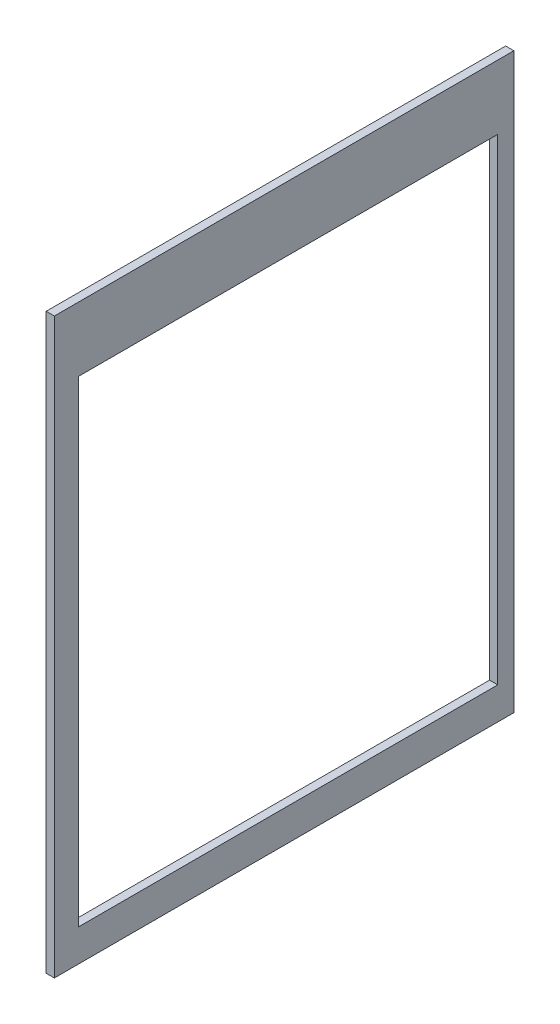
ISO-10303-21;
HEADER;
FILE_DESCRIPTION(('STEP AP214'),'2;1');
FILE_NAME('part.step','',(''),(''),'','','');
FILE_SCHEMA(('AUTOMOTIVE_DESIGN { 1 0 10303 214 1 1 1 1 }'));
ENDSEC;
DATA;
#1=APPLICATION_CONTEXT('core data for automotive mechanical design processes');
#2=APPLICATION_PROTOCOL_DEFINITION('international standard','automotive_design',2000,#1);
#3=PRODUCT_CONTEXT('',#1,'mechanical');
#4=PRODUCT('Part','Part','',(#3));
#5=PRODUCT_RELATED_PRODUCT_CATEGORY('part','',(#4));
#6=PRODUCT_DEFINITION_FORMATION('','',#4);
#7=PRODUCT_DEFINITION_CONTEXT('part definition',#1,'design');
#8=PRODUCT_DEFINITION('design','',#6,#7);
#9=PRODUCT_DEFINITION_SHAPE('','',#8);
#10=(LENGTH_UNIT() NAMED_UNIT(*) SI_UNIT(.MILLI.,.METRE.));
#11=(NAMED_UNIT(*) PLANE_ANGLE_UNIT() SI_UNIT($,.RADIAN.));
#12=(NAMED_UNIT(*) SI_UNIT($,.STERADIAN.) SOLID_ANGLE_UNIT());
#13=UNCERTAINTY_MEASURE_WITH_UNIT(LENGTH_MEASURE(1.E-05),#10,'distance_accuracy_value','');
#14=(GEOMETRIC_REPRESENTATION_CONTEXT(3) GLOBAL_UNCERTAINTY_ASSIGNED_CONTEXT((#13)) GLOBAL_UNIT_ASSIGNED_CONTEXT((#10,
#11,#12)) REPRESENTATION_CONTEXT('',''));
#15=CARTESIAN_POINT('',(0.,0.,0.));
#16=DIRECTION('',(0.,0.,1.));
#17=DIRECTION('',(1.,0.,0.));
#18=AXIS2_PLACEMENT_3D('',#15,#16,#17);
#19=CARTESIAN_POINT('',(5.,0.,0.));
#20=DIRECTION('',(1.,0.,0.));
#21=DIRECTION('',(0.,0.,-1.));
#22=AXIS2_PLACEMENT_3D('',#19,#20,#21);
#23=PLANE('',#22);
#24=DIRECTION('',(0.,-1.,0.));
#25=VECTOR('',#24,1.);
#26=CARTESIAN_POINT('',(5.,326.782544852726,389.321741886419));
#27=LINE('',#26,#25);
#28=CARTESIAN_POINT('',(5.,326.782544852726,389.321741886419));
#29=VERTEX_POINT('',#28);
#30=CARTESIAN_POINT('',(5.,-23.217455147274,389.321741886419));
#31=VERTEX_POINT('',#30);
#32=EDGE_CURVE('E136',#29,#31,#27,.T.);
#33=ORIENTED_EDGE('',*,*,#32,.T.);
#34=DIRECTION('',(0.,0.,-1.));
#35=VECTOR('',#34,1.);
#36=CARTESIAN_POINT('',(5.,-23.217455147274,389.321741886419));
#37=LINE('',#36,#35);
#38=CARTESIAN_POINT('',(5.,-23.217455147274,108.821741886419));
#39=VERTEX_POINT('',#38);
#40=EDGE_CURVE('E139',#31,#39,#37,.T.);
#41=ORIENTED_EDGE('',*,*,#40,.T.);
#42=DIRECTION('',(0.,1.,0.));
#43=VECTOR('',#42,1.);
#44=CARTESIAN_POINT('',(5.,326.782544852726,108.821741886419));
#45=LINE('',#44,#43);
#46=CARTESIAN_POINT('',(5.,326.782544852726,108.821741886419));
#47=VERTEX_POINT('',#46);
#48=EDGE_CURVE('E142',#39,#47,#45,.T.);
#49=ORIENTED_EDGE('',*,*,#48,.T.);
#50=DIRECTION('',(0.,0.,1.));
#51=VECTOR('',#50,1.);
#52=CARTESIAN_POINT('',(5.,326.782544852726,389.321741886419));
#53=LINE('',#52,#51);
#54=EDGE_CURVE('E144',#47,#29,#53,.T.);
#55=ORIENTED_EDGE('',*,*,#54,.T.);
#56=EDGE_LOOP('',(#33,#41,#49,#55));
#57=FACE_BOUND('',#56,.T.);
#58=DIRECTION('',(0.,0.,1.));
#59=VECTOR('',#58,1.);
#60=CARTESIAN_POINT('',(5.,287.483070246771,118.646610537907));
#61=LINE('',#60,#59);
#62=CARTESIAN_POINT('',(5.,287.483070246771,118.646610537907));
#63=VERTEX_POINT('',#62);
#64=CARTESIAN_POINT('',(5.,287.483070246771,374.584438909186));
#65=VERTEX_POINT('',#64);
#66=EDGE_CURVE('E108',#63,#65,#61,.T.);
#67=ORIENTED_EDGE('',*,*,#66,.F.);
#68=DIRECTION('',(0.,1.,0.));
#69=VECTOR('',#68,1.);
#70=CARTESIAN_POINT('',(5.,-3.56771784429681,118.646610537907));
#71=LINE('',#70,#69);
#72=CARTESIAN_POINT('',(5.,-3.56771784429681,118.646610537907));
#73=VERTEX_POINT('',#72);
#74=EDGE_CURVE('E100',#73,#63,#71,.T.);
#75=ORIENTED_EDGE('',*,*,#74,.F.);
#76=DIRECTION('',(0.,0.,-1.));
#77=VECTOR('',#76,1.);
#78=CARTESIAN_POINT('',(5.,-3.56771784429681,118.646610537907));
#79=LINE('',#78,#77);
#80=CARTESIAN_POINT('',(5.,-3.56771784429681,374.584438909186));
#81=VERTEX_POINT('',#80);
#82=EDGE_CURVE('E122',#81,#73,#79,.T.);
#83=ORIENTED_EDGE('',*,*,#82,.F.);
#84=DIRECTION('',(0.,-1.,0.));
#85=VECTOR('',#84,1.);
#86=CARTESIAN_POINT('',(5.,-3.56771784429681,374.584438909186));
#87=LINE('',#86,#85);
#88=EDGE_CURVE('E120',#65,#81,#87,.T.);
#89=ORIENTED_EDGE('',*,*,#88,.F.);
#90=EDGE_LOOP('',(#67,#75,#83,#89));
#91=FACE_BOUND('',#90,.T.);
#92=ADVANCED_FACE('F35',(#57,#91),#23,.T.);
#93=CARTESIAN_POINT('',(0.,0.,0.));
#94=DIRECTION('',(1.,0.,0.));
#95=DIRECTION('',(0.,0.,-1.));
#96=AXIS2_PLACEMENT_3D('',#93,#94,#95);
#97=PLANE('',#96);
#98=DIRECTION('',(0.,-1.,0.));
#99=VECTOR('',#98,1.);
#100=CARTESIAN_POINT('',(0.,326.782544852726,389.321741886419));
#101=LINE('',#100,#99);
#102=CARTESIAN_POINT('',(0.,326.782544852726,389.321741886419));
#103=VERTEX_POINT('',#102);
#104=CARTESIAN_POINT('',(0.,-23.217455147274,389.321741886419));
#105=VERTEX_POINT('',#104);
#106=EDGE_CURVE('E116',#103,#105,#101,.T.);
#107=ORIENTED_EDGE('',*,*,#106,.F.);
#108=DIRECTION('',(0.,0.,1.));
#109=VECTOR('',#108,1.);
#110=CARTESIAN_POINT('',(0.,326.782544852726,389.321741886419));
#111=LINE('',#110,#109);
#112=CARTESIAN_POINT('',(0.,326.782544852726,108.821741886419));
#113=VERTEX_POINT('',#112);
#114=EDGE_CURVE('E140',#113,#103,#111,.T.);
#115=ORIENTED_EDGE('',*,*,#114,.F.);
#116=DIRECTION('',(0.,1.,0.));
#117=VECTOR('',#116,1.);
#118=CARTESIAN_POINT('',(0.,326.782544852726,108.821741886419));
#119=LINE('',#118,#117);
#120=CARTESIAN_POINT('',(0.,-23.217455147274,108.821741886419));
#121=VERTEX_POINT('',#120);
#122=EDGE_CURVE('E151',#121,#113,#119,.T.);
#123=ORIENTED_EDGE('',*,*,#122,.F.);
#124=DIRECTION('',(0.,0.,-1.));
#125=VECTOR('',#124,1.);
#126=CARTESIAN_POINT('',(0.,-23.217455147274,389.321741886419));
#127=LINE('',#126,#125);
#128=EDGE_CURVE('E149',#105,#121,#127,.T.);
#129=ORIENTED_EDGE('',*,*,#128,.F.);
#130=EDGE_LOOP('',(#107,#115,#123,#129));
#131=FACE_BOUND('',#130,.T.);
#132=DIRECTION('',(0.,1.,0.));
#133=VECTOR('',#132,1.);
#134=CARTESIAN_POINT('',(0.,-3.56771784429681,118.646610537907));
#135=LINE('',#134,#133);
#136=CARTESIAN_POINT('',(0.,-3.56771784429681,118.646610537907));
#137=VERTEX_POINT('',#136);
#138=CARTESIAN_POINT('',(0.,287.483070246771,118.646610537907));
#139=VERTEX_POINT('',#138);
#140=EDGE_CURVE('E58',#137,#139,#135,.T.);
#141=ORIENTED_EDGE('',*,*,#140,.T.);
#142=DIRECTION('',(0.,0.,1.));
#143=VECTOR('',#142,1.);
#144=CARTESIAN_POINT('',(0.,287.483070246771,118.646610537907));
#145=LINE('',#144,#143);
#146=CARTESIAN_POINT('',(0.,287.483070246771,374.584438909186));
#147=VERTEX_POINT('',#146);
#148=EDGE_CURVE('E115',#139,#147,#145,.T.);
#149=ORIENTED_EDGE('',*,*,#148,.T.);
#150=DIRECTION('',(0.,-1.,0.));
#151=VECTOR('',#150,1.);
#152=CARTESIAN_POINT('',(0.,-3.56771784429681,374.584438909186));
#153=LINE('',#152,#151);
#154=CARTESIAN_POINT('',(0.,-3.56771784429681,374.584438909186));
#155=VERTEX_POINT('',#154);
#156=EDGE_CURVE('E128',#147,#155,#153,.T.);
#157=ORIENTED_EDGE('',*,*,#156,.T.);
#158=DIRECTION('',(0.,0.,-1.));
#159=VECTOR('',#158,1.);
#160=CARTESIAN_POINT('',(0.,-3.56771784429681,118.646610537907));
#161=LINE('',#160,#159);
#162=EDGE_CURVE('E109',#155,#137,#161,.T.);
#163=ORIENTED_EDGE('',*,*,#162,.T.);
#164=EDGE_LOOP('',(#141,#149,#157,#163));
#165=FACE_BOUND('',#164,.T.);
#166=ADVANCED_FACE('F169',(#131,#165),#97,.F.);
#167=CARTESIAN_POINT('',(5.,326.782544852726,389.321741886419));
#168=DIRECTION('',(0.,0.,-1.));
#169=DIRECTION('',(0.,1.,0.));
#170=AXIS2_PLACEMENT_3D('',#167,#168,#169);
#171=PLANE('',#170);
#172=ORIENTED_EDGE('',*,*,#106,.T.);
#173=DIRECTION('',(-1.,0.,0.));
#174=VECTOR('',#173,1.);
#175=CARTESIAN_POINT('',(5.,-23.217455147274,389.321741886419));
#176=LINE('',#175,#174);
#177=EDGE_CURVE('E11',#31,#105,#176,.T.);
#178=ORIENTED_EDGE('',*,*,#177,.F.);
#179=ORIENTED_EDGE('',*,*,#32,.F.);
#180=DIRECTION('',(-1.,0.,0.));
#181=VECTOR('',#180,1.);
#182=CARTESIAN_POINT('',(5.,326.782544852726,389.321741886419));
#183=LINE('',#182,#181);
#184=EDGE_CURVE('E146',#29,#103,#183,.T.);
#185=ORIENTED_EDGE('',*,*,#184,.T.);
#186=EDGE_LOOP('',(#172,#178,#179,#185));
#187=FACE_BOUND('',#186,.T.);
#188=ADVANCED_FACE('F37',(#187),#171,.F.);
#189=CARTESIAN_POINT('',(5.,-23.217455147274,389.321741886419));
#190=DIRECTION('',(0.,1.,0.));
#191=DIRECTION('',(0.,0.,1.));
#192=AXIS2_PLACEMENT_3D('',#189,#190,#191);
#193=PLANE('',#192);
#194=ORIENTED_EDGE('',*,*,#128,.T.);
#195=DIRECTION('',(-1.,0.,0.));
#196=VECTOR('',#195,1.);
#197=CARTESIAN_POINT('',(5.,-23.217455147274,108.821741886419));
#198=LINE('',#197,#196);
#199=EDGE_CURVE('E43',#39,#121,#198,.T.);
#200=ORIENTED_EDGE('',*,*,#199,.F.);
#201=ORIENTED_EDGE('',*,*,#40,.F.);
#202=ORIENTED_EDGE('',*,*,#177,.T.);
#203=EDGE_LOOP('',(#194,#200,#201,#202));
#204=FACE_BOUND('',#203,.T.);
#205=ADVANCED_FACE('F179',(#204),#193,.F.);
#206=CARTESIAN_POINT('',(5.,326.782544852726,108.821741886419));
#207=DIRECTION('',(0.,0.,1.));
#208=DIRECTION('',(0.,-1.,0.));
#209=AXIS2_PLACEMENT_3D('',#206,#207,#208);
#210=PLANE('',#209);
#211=ORIENTED_EDGE('',*,*,#122,.T.);
#212=DIRECTION('',(-1.,0.,0.));
#213=VECTOR('',#212,1.);
#214=CARTESIAN_POINT('',(5.,326.782544852726,108.821741886419));
#215=LINE('',#214,#213);
#216=EDGE_CURVE('E156',#47,#113,#215,.T.);
#217=ORIENTED_EDGE('',*,*,#216,.F.);
#218=ORIENTED_EDGE('',*,*,#48,.F.);
#219=ORIENTED_EDGE('',*,*,#199,.T.);
#220=EDGE_LOOP('',(#211,#217,#218,#219));
#221=FACE_BOUND('',#220,.T.);
#222=ADVANCED_FACE('F163',(#221),#210,.F.);
#223=CARTESIAN_POINT('',(5.,326.782544852726,389.321741886419));
#224=DIRECTION('',(0.,-1.,0.));
#225=DIRECTION('',(0.,0.,-1.));
#226=AXIS2_PLACEMENT_3D('',#223,#224,#225);
#227=PLANE('',#226);
#228=ORIENTED_EDGE('',*,*,#114,.T.);
#229=ORIENTED_EDGE('',*,*,#184,.F.);
#230=ORIENTED_EDGE('',*,*,#54,.F.);
#231=ORIENTED_EDGE('',*,*,#216,.T.);
#232=EDGE_LOOP('',(#228,#229,#230,#231));
#233=FACE_BOUND('',#232,.T.);
#234=ADVANCED_FACE('F173',(#233),#227,.F.);
#235=CARTESIAN_POINT('',(5.,-3.56771784429681,118.646610537907));
#236=DIRECTION('',(0.,0.,1.));
#237=DIRECTION('',(1.,0.,0.));
#238=AXIS2_PLACEMENT_3D('',#235,#236,#237);
#239=PLANE('',#238);
#240=ORIENTED_EDGE('',*,*,#140,.F.);
#241=DIRECTION('',(-1.,0.,0.));
#242=VECTOR('',#241,1.);
#243=CARTESIAN_POINT('',(5.,-3.56771784429681,118.646610537907));
#244=LINE('',#243,#242);
#245=EDGE_CURVE('E104',#73,#137,#244,.T.);
#246=ORIENTED_EDGE('',*,*,#245,.F.);
#247=ORIENTED_EDGE('',*,*,#74,.T.);
#248=DIRECTION('',(-1.,0.,0.));
#249=VECTOR('',#248,1.);
#250=CARTESIAN_POINT('',(5.,287.483070246771,118.646610537907));
#251=LINE('',#250,#249);
#252=EDGE_CURVE('E103',#63,#139,#251,.T.);
#253=ORIENTED_EDGE('',*,*,#252,.T.);
#254=EDGE_LOOP('',(#240,#246,#247,#253));
#255=FACE_BOUND('',#254,.T.);
#256=ADVANCED_FACE('F102',(#255),#239,.T.);
#257=CARTESIAN_POINT('',(5.,287.483070246771,118.646610537907));
#258=DIRECTION('',(0.,-1.,0.));
#259=DIRECTION('',(0.,0.,-1.));
#260=AXIS2_PLACEMENT_3D('',#257,#258,#259);
#261=PLANE('',#260);
#262=ORIENTED_EDGE('',*,*,#148,.F.);
#263=ORIENTED_EDGE('',*,*,#252,.F.);
#264=ORIENTED_EDGE('',*,*,#66,.T.);
#265=DIRECTION('',(-1.,0.,0.));
#266=VECTOR('',#265,1.);
#267=CARTESIAN_POINT('',(5.,287.483070246771,374.584438909186));
#268=LINE('',#267,#266);
#269=EDGE_CURVE('E117',#65,#147,#268,.T.);
#270=ORIENTED_EDGE('',*,*,#269,.T.);
#271=EDGE_LOOP('',(#262,#263,#264,#270));
#272=FACE_BOUND('',#271,.T.);
#273=ADVANCED_FACE('F112',(#272),#261,.T.);
#274=CARTESIAN_POINT('',(5.,-3.56771784429681,374.584438909186));
#275=DIRECTION('',(0.,0.,-1.));
#276=DIRECTION('',(-1.,0.,0.));
#277=AXIS2_PLACEMENT_3D('',#274,#275,#276);
#278=PLANE('',#277);
#279=ORIENTED_EDGE('',*,*,#156,.F.);
#280=ORIENTED_EDGE('',*,*,#269,.F.);
#281=ORIENTED_EDGE('',*,*,#88,.T.);
#282=DIRECTION('',(-1.,0.,0.));
#283=VECTOR('',#282,1.);
#284=CARTESIAN_POINT('',(5.,-3.56771784429681,374.584438909186));
#285=LINE('',#284,#283);
#286=EDGE_CURVE('E50',#81,#155,#285,.T.);
#287=ORIENTED_EDGE('',*,*,#286,.T.);
#288=EDGE_LOOP('',(#279,#280,#281,#287));
#289=FACE_BOUND('',#288,.T.);
#290=ADVANCED_FACE('F202',(#289),#278,.T.);
#291=CARTESIAN_POINT('',(5.,-3.56771784429681,118.646610537907));
#292=DIRECTION('',(0.,1.,0.));
#293=DIRECTION('',(0.,0.,1.));
#294=AXIS2_PLACEMENT_3D('',#291,#292,#293);
#295=PLANE('',#294);
#296=ORIENTED_EDGE('',*,*,#162,.F.);
#297=ORIENTED_EDGE('',*,*,#286,.F.);
#298=ORIENTED_EDGE('',*,*,#82,.T.);
#299=ORIENTED_EDGE('',*,*,#245,.T.);
#300=EDGE_LOOP('',(#296,#297,#298,#299));
#301=FACE_BOUND('',#300,.T.);
#302=ADVANCED_FACE('F206',(#301),#295,.T.);
#303=CLOSED_SHELL('',(#92,#166,#188,#205,#222,#234,#256,#273,#290,#302));
#304=MANIFOLD_SOLID_BREP('B2',#303);
#305=ADVANCED_BREP_SHAPE_REPRESENTATION('',(#18,#304),#14);
#306=SHAPE_DEFINITION_REPRESENTATION(#9,#305);
ENDSEC;
END-ISO-10303-21;
